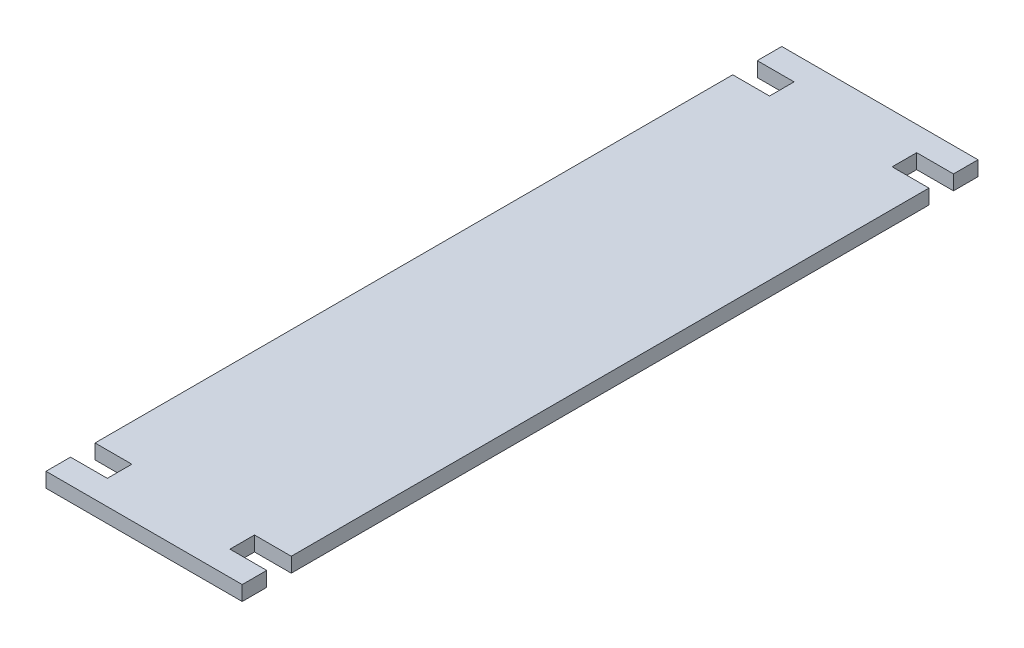
ISO-10303-21;
HEADER;
FILE_DESCRIPTION(('STEP AP214'),'2;1');
FILE_NAME('part.step','',(''),(''),'','','');
FILE_SCHEMA(('AUTOMOTIVE_DESIGN { 1 0 10303 214 1 1 1 1 }'));
ENDSEC;
DATA;
#1=APPLICATION_CONTEXT('core data for automotive mechanical design processes');
#2=APPLICATION_PROTOCOL_DEFINITION('international standard','automotive_design',2000,#1);
#3=PRODUCT_CONTEXT('',#1,'mechanical');
#4=PRODUCT('Part','Part','',(#3));
#5=PRODUCT_RELATED_PRODUCT_CATEGORY('part','',(#4));
#6=PRODUCT_DEFINITION_FORMATION('','',#4);
#7=PRODUCT_DEFINITION_CONTEXT('part definition',#1,'design');
#8=PRODUCT_DEFINITION('design','',#6,#7);
#9=PRODUCT_DEFINITION_SHAPE('','',#8);
#10=(LENGTH_UNIT() NAMED_UNIT(*) SI_UNIT(.MILLI.,.METRE.));
#11=(NAMED_UNIT(*) PLANE_ANGLE_UNIT() SI_UNIT($,.RADIAN.));
#12=(NAMED_UNIT(*) SI_UNIT($,.STERADIAN.) SOLID_ANGLE_UNIT());
#13=UNCERTAINTY_MEASURE_WITH_UNIT(LENGTH_MEASURE(1.E-05),#10,'distance_accuracy_value','');
#14=(GEOMETRIC_REPRESENTATION_CONTEXT(3) GLOBAL_UNCERTAINTY_ASSIGNED_CONTEXT((#13)) GLOBAL_UNIT_ASSIGNED_CONTEXT((#10,
#11,#12)) REPRESENTATION_CONTEXT('',''));
#15=CARTESIAN_POINT('',(0.,0.,0.));
#16=DIRECTION('',(0.,0.,1.));
#17=DIRECTION('',(1.,0.,0.));
#18=AXIS2_PLACEMENT_3D('',#15,#16,#17);
#19=CARTESIAN_POINT('',(0.,3.,0.));
#20=DIRECTION('',(1.,0.,0.));
#21=DIRECTION('',(0.,0.,-1.));
#22=AXIS2_PLACEMENT_3D('',#19,#20,#21);
#23=PLANE('',#22);
#24=DIRECTION('',(0.,-1.,0.));
#25=VECTOR('',#24,1.);
#26=CARTESIAN_POINT('',(0.,10.,-5.));
#27=LINE('',#26,#25);
#28=CARTESIAN_POINT('',(0.,3.,-5.));
#29=VERTEX_POINT('',#28);
#30=CARTESIAN_POINT('',(0.,0.,-5.));
#31=VERTEX_POINT('',#30);
#32=EDGE_CURVE('E198',#29,#31,#27,.T.);
#33=ORIENTED_EDGE('',*,*,#32,.T.);
#34=DIRECTION('',(0.,0.,1.));
#35=VECTOR('',#34,1.);
#36=CARTESIAN_POINT('',(0.,0.,0.));
#37=LINE('',#36,#35);
#38=CARTESIAN_POINT('',(0.,0.,0.));
#39=VERTEX_POINT('',#38);
#40=EDGE_CURVE('E228',#31,#39,#37,.T.);
#41=ORIENTED_EDGE('',*,*,#40,.T.);
#42=DIRECTION('',(0.,-1.,0.));
#43=VECTOR('',#42,1.);
#44=CARTESIAN_POINT('',(0.,3.,0.));
#45=LINE('',#44,#43);
#46=CARTESIAN_POINT('',(0.,3.,0.));
#47=VERTEX_POINT('',#46);
#48=EDGE_CURVE('E11',#47,#39,#45,.T.);
#49=ORIENTED_EDGE('',*,*,#48,.F.);
#50=DIRECTION('',(0.,0.,1.));
#51=VECTOR('',#50,1.);
#52=CARTESIAN_POINT('',(0.,3.,0.));
#53=LINE('',#52,#51);
#54=EDGE_CURVE('E210',#29,#47,#53,.T.);
#55=ORIENTED_EDGE('',*,*,#54,.F.);
#56=EDGE_LOOP('',(#33,#41,#49,#55));
#57=FACE_BOUND('',#56,.T.);
#58=ADVANCED_FACE('F38',(#57),#23,.F.);
#59=DIRECTION('',(0.,-1.,0.));
#60=VECTOR('',#59,1.);
#61=CARTESIAN_POINT('',(0.,10.,-10.));
#62=LINE('',#61,#60);
#63=CARTESIAN_POINT('',(0.,3.,-10.));
#64=VERTEX_POINT('',#63);
#65=CARTESIAN_POINT('',(0.,0.,-10.));
#66=VERTEX_POINT('',#65);
#67=EDGE_CURVE('E342',#64,#66,#62,.T.);
#68=ORIENTED_EDGE('',*,*,#67,.F.);
#69=CARTESIAN_POINT('',(0.,3.,-140.));
#70=VERTEX_POINT('',#69);
#71=EDGE_CURVE('E246',#70,#64,#53,.T.);
#72=ORIENTED_EDGE('',*,*,#71,.F.);
#73=DIRECTION('',(0.,-1.,0.));
#74=VECTOR('',#73,1.);
#75=CARTESIAN_POINT('',(0.,10.,-140.));
#76=LINE('',#75,#74);
#77=CARTESIAN_POINT('',(0.,0.,-140.));
#78=VERTEX_POINT('',#77);
#79=EDGE_CURVE('E290',#70,#78,#76,.T.);
#80=ORIENTED_EDGE('',*,*,#79,.T.);
#81=EDGE_CURVE('E226',#78,#66,#37,.T.);
#82=ORIENTED_EDGE('',*,*,#81,.T.);
#83=EDGE_LOOP('',(#68,#72,#80,#82));
#84=FACE_BOUND('',#83,.T.);
#85=ADVANCED_FACE('F422',(#84),#23,.F.);
#86=CARTESIAN_POINT('',(0.,0.,-150.));
#87=VERTEX_POINT('',#86);
#88=CARTESIAN_POINT('',(0.,0.,-145.));
#89=VERTEX_POINT('',#88);
#90=EDGE_CURVE('E222',#87,#89,#37,.T.);
#91=ORIENTED_EDGE('',*,*,#90,.T.);
#92=DIRECTION('',(0.,-1.,0.));
#93=VECTOR('',#92,1.);
#94=CARTESIAN_POINT('',(0.,10.,-145.));
#95=LINE('',#94,#93);
#96=CARTESIAN_POINT('',(0.,3.,-145.));
#97=VERTEX_POINT('',#96);
#98=EDGE_CURVE('E287',#97,#89,#95,.T.);
#99=ORIENTED_EDGE('',*,*,#98,.F.);
#100=CARTESIAN_POINT('',(0.,3.,-150.));
#101=VERTEX_POINT('',#100);
#102=EDGE_CURVE('E242',#101,#97,#53,.T.);
#103=ORIENTED_EDGE('',*,*,#102,.F.);
#104=DIRECTION('',(0.,-1.,0.));
#105=VECTOR('',#104,1.);
#106=CARTESIAN_POINT('',(0.,3.,-150.));
#107=LINE('',#106,#105);
#108=EDGE_CURVE('E233',#101,#87,#107,.T.);
#109=ORIENTED_EDGE('',*,*,#108,.T.);
#110=EDGE_LOOP('',(#91,#99,#103,#109));
#111=FACE_BOUND('',#110,.T.);
#112=ADVANCED_FACE('F405',(#111),#23,.F.);
#113=CARTESIAN_POINT('',(40.,3.,0.));
#114=DIRECTION('',(-1.,0.,0.));
#115=DIRECTION('',(0.,0.,1.));
#116=AXIS2_PLACEMENT_3D('',#113,#114,#115);
#117=PLANE('',#116);
#118=DIRECTION('',(0.,-1.,0.));
#119=VECTOR('',#118,1.);
#120=CARTESIAN_POINT('',(40.,10.,-140.));
#121=LINE('',#120,#119);
#122=CARTESIAN_POINT('',(40.,3.,-140.));
#123=VERTEX_POINT('',#122);
#124=CARTESIAN_POINT('',(40.,0.,-140.));
#125=VERTEX_POINT('',#124);
#126=EDGE_CURVE('E314',#123,#125,#121,.T.);
#127=ORIENTED_EDGE('',*,*,#126,.F.);
#128=DIRECTION('',(0.,0.,-1.));
#129=VECTOR('',#128,1.);
#130=CARTESIAN_POINT('',(40.,3.,0.));
#131=LINE('',#130,#129);
#132=CARTESIAN_POINT('',(40.,3.,-10.));
#133=VERTEX_POINT('',#132);
#134=EDGE_CURVE('E237',#133,#123,#131,.T.);
#135=ORIENTED_EDGE('',*,*,#134,.F.);
#136=DIRECTION('',(0.,-1.,0.));
#137=VECTOR('',#136,1.);
#138=CARTESIAN_POINT('',(40.,10.,-10.));
#139=LINE('',#138,#137);
#140=CARTESIAN_POINT('',(40.,0.,-10.));
#141=VERTEX_POINT('',#140);
#142=EDGE_CURVE('E185',#133,#141,#139,.T.);
#143=ORIENTED_EDGE('',*,*,#142,.T.);
#144=DIRECTION('',(0.,0.,-1.));
#145=VECTOR('',#144,1.);
#146=CARTESIAN_POINT('',(40.,0.,0.));
#147=LINE('',#146,#145);
#148=EDGE_CURVE('E205',#141,#125,#147,.T.);
#149=ORIENTED_EDGE('',*,*,#148,.T.);
#150=EDGE_LOOP('',(#127,#135,#143,#149));
#151=FACE_BOUND('',#150,.T.);
#152=ADVANCED_FACE('F375',(#151),#117,.F.);
#153=DIRECTION('',(0.,-1.,0.));
#154=VECTOR('',#153,1.);
#155=CARTESIAN_POINT('',(40.,10.,-145.));
#156=LINE('',#155,#154);
#157=CARTESIAN_POINT('',(40.,3.,-145.));
#158=VERTEX_POINT('',#157);
#159=CARTESIAN_POINT('',(40.,0.,-145.));
#160=VERTEX_POINT('',#159);
#161=EDGE_CURVE('E317',#158,#160,#156,.T.);
#162=ORIENTED_EDGE('',*,*,#161,.T.);
#163=CARTESIAN_POINT('',(40.,0.,-150.));
#164=VERTEX_POINT('',#163);
#165=EDGE_CURVE('E207',#160,#164,#147,.T.);
#166=ORIENTED_EDGE('',*,*,#165,.T.);
#167=DIRECTION('',(0.,-1.,0.));
#168=VECTOR('',#167,1.);
#169=CARTESIAN_POINT('',(40.,3.,-150.));
#170=LINE('',#169,#168);
#171=CARTESIAN_POINT('',(40.,3.,-150.));
#172=VERTEX_POINT('',#171);
#173=EDGE_CURVE('E391',#172,#164,#170,.T.);
#174=ORIENTED_EDGE('',*,*,#173,.F.);
#175=EDGE_CURVE('E238',#158,#172,#131,.T.);
#176=ORIENTED_EDGE('',*,*,#175,.F.);
#177=EDGE_LOOP('',(#162,#166,#174,#176));
#178=FACE_BOUND('',#177,.T.);
#179=ADVANCED_FACE('F392',(#178),#117,.F.);
#180=CARTESIAN_POINT('',(40.,0.,0.));
#181=VERTEX_POINT('',#180);
#182=CARTESIAN_POINT('',(40.,0.,-5.));
#183=VERTEX_POINT('',#182);
#184=EDGE_CURVE('E192',#181,#183,#147,.T.);
#185=ORIENTED_EDGE('',*,*,#184,.T.);
#186=DIRECTION('',(0.,-1.,0.));
#187=VECTOR('',#186,1.);
#188=CARTESIAN_POINT('',(40.,10.,-5.));
#189=LINE('',#188,#187);
#190=CARTESIAN_POINT('',(40.,3.,-5.));
#191=VERTEX_POINT('',#190);
#192=EDGE_CURVE('E175',#191,#183,#189,.T.);
#193=ORIENTED_EDGE('',*,*,#192,.F.);
#194=CARTESIAN_POINT('',(40.,3.,0.));
#195=VERTEX_POINT('',#194);
#196=EDGE_CURVE('E234',#195,#191,#131,.T.);
#197=ORIENTED_EDGE('',*,*,#196,.F.);
#198=DIRECTION('',(0.,-1.,0.));
#199=VECTOR('',#198,1.);
#200=CARTESIAN_POINT('',(40.,3.,0.));
#201=LINE('',#200,#199);
#202=EDGE_CURVE('E46',#195,#181,#201,.T.);
#203=ORIENTED_EDGE('',*,*,#202,.T.);
#204=EDGE_LOOP('',(#185,#193,#197,#203));
#205=FACE_BOUND('',#204,.T.);
#206=ADVANCED_FACE('F201',(#205),#117,.F.);
#207=CARTESIAN_POINT('',(0.,3.,0.));
#208=DIRECTION('',(0.,-1.,0.));
#209=DIRECTION('',(0.,0.,-1.));
#210=AXIS2_PLACEMENT_3D('',#207,#208,#209);
#211=PLANE('',#210);
#212=DIRECTION('',(1.,0.,0.));
#213=VECTOR('',#212,1.);
#214=CARTESIAN_POINT('',(0.,3.,-140.));
#215=LINE('',#214,#213);
#216=CARTESIAN_POINT('',(32.5,3.,-140.));
#217=VERTEX_POINT('',#216);
#218=EDGE_CURVE('E250',#217,#123,#215,.T.);
#219=ORIENTED_EDGE('',*,*,#218,.F.);
#220=DIRECTION('',(0.,0.,1.));
#221=VECTOR('',#220,1.);
#222=CARTESIAN_POINT('',(32.5,3.,0.));
#223=LINE('',#222,#221);
#224=CARTESIAN_POINT('',(32.5,3.,-145.));
#225=VERTEX_POINT('',#224);
#226=EDGE_CURVE('E247',#225,#217,#223,.T.);
#227=ORIENTED_EDGE('',*,*,#226,.F.);
#228=DIRECTION('',(-1.,0.,0.));
#229=VECTOR('',#228,1.);
#230=CARTESIAN_POINT('',(0.,3.,-145.));
#231=LINE('',#230,#229);
#232=EDGE_CURVE('E253',#158,#225,#231,.T.);
#233=ORIENTED_EDGE('',*,*,#232,.F.);
#234=ORIENTED_EDGE('',*,*,#175,.T.);
#235=DIRECTION('',(-1.,0.,0.));
#236=VECTOR('',#235,1.);
#237=CARTESIAN_POINT('',(0.,3.,-150.));
#238=LINE('',#237,#236);
#239=EDGE_CURVE('E230',#172,#101,#238,.T.);
#240=ORIENTED_EDGE('',*,*,#239,.T.);
#241=ORIENTED_EDGE('',*,*,#102,.T.);
#242=DIRECTION('',(1.,0.,0.));
#243=VECTOR('',#242,1.);
#244=CARTESIAN_POINT('',(0.,3.,-145.));
#245=LINE('',#244,#243);
#246=CARTESIAN_POINT('',(7.5,3.,-145.));
#247=VERTEX_POINT('',#246);
#248=EDGE_CURVE('E275',#97,#247,#245,.T.);
#249=ORIENTED_EDGE('',*,*,#248,.T.);
#250=DIRECTION('',(0.,0.,1.));
#251=VECTOR('',#250,1.);
#252=CARTESIAN_POINT('',(7.50000000000002,3.,0.));
#253=LINE('',#252,#251);
#254=CARTESIAN_POINT('',(7.5,3.,-140.));
#255=VERTEX_POINT('',#254);
#256=EDGE_CURVE('E283',#247,#255,#253,.T.);
#257=ORIENTED_EDGE('',*,*,#256,.T.);
#258=DIRECTION('',(-1.,0.,0.));
#259=VECTOR('',#258,1.);
#260=CARTESIAN_POINT('',(0.,3.,-140.));
#261=LINE('',#260,#259);
#262=EDGE_CURVE('E279',#255,#70,#261,.T.);
#263=ORIENTED_EDGE('',*,*,#262,.T.);
#264=ORIENTED_EDGE('',*,*,#71,.T.);
#265=DIRECTION('',(-1.,0.,0.));
#266=VECTOR('',#265,1.);
#267=CARTESIAN_POINT('',(0.,3.,-10.));
#268=LINE('',#267,#266);
#269=CARTESIAN_POINT('',(7.5,3.,-10.));
#270=VERTEX_POINT('',#269);
#271=EDGE_CURVE('E262',#270,#64,#268,.T.);
#272=ORIENTED_EDGE('',*,*,#271,.F.);
#273=DIRECTION('',(0.,0.,-1.));
#274=VECTOR('',#273,1.);
#275=CARTESIAN_POINT('',(7.5,3.,0.));
#276=LINE('',#275,#274);
#277=CARTESIAN_POINT('',(7.5,3.,-5.));
#278=VERTEX_POINT('',#277);
#279=EDGE_CURVE('E259',#278,#270,#276,.T.);
#280=ORIENTED_EDGE('',*,*,#279,.F.);
#281=DIRECTION('',(1.,0.,0.));
#282=VECTOR('',#281,1.);
#283=CARTESIAN_POINT('',(0.,3.,-5.));
#284=LINE('',#283,#282);
#285=EDGE_CURVE('E256',#29,#278,#284,.T.);
#286=ORIENTED_EDGE('',*,*,#285,.F.);
#287=ORIENTED_EDGE('',*,*,#54,.T.);
#288=DIRECTION('',(1.,0.,0.));
#289=VECTOR('',#288,1.);
#290=CARTESIAN_POINT('',(0.,3.,0.));
#291=LINE('',#290,#289);
#292=EDGE_CURVE('E239',#47,#195,#291,.T.);
#293=ORIENTED_EDGE('',*,*,#292,.T.);
#294=ORIENTED_EDGE('',*,*,#196,.T.);
#295=DIRECTION('',(-1.,0.,0.));
#296=VECTOR('',#295,1.);
#297=CARTESIAN_POINT('',(0.,3.,-5.));
#298=LINE('',#297,#296);
#299=CARTESIAN_POINT('',(32.5,3.,-5.));
#300=VERTEX_POINT('',#299);
#301=EDGE_CURVE('E178',#191,#300,#298,.T.);
#302=ORIENTED_EDGE('',*,*,#301,.T.);
#303=DIRECTION('',(0.,0.,-1.));
#304=VECTOR('',#303,1.);
#305=CARTESIAN_POINT('',(32.5,3.,0.));
#306=LINE('',#305,#304);
#307=CARTESIAN_POINT('',(32.5,3.,-10.));
#308=VERTEX_POINT('',#307);
#309=EDGE_CURVE('E271',#300,#308,#306,.T.);
#310=ORIENTED_EDGE('',*,*,#309,.T.);
#311=DIRECTION('',(1.,0.,0.));
#312=VECTOR('',#311,1.);
#313=CARTESIAN_POINT('',(0.,3.,-10.));
#314=LINE('',#313,#312);
#315=EDGE_CURVE('E267',#308,#133,#314,.T.);
#316=ORIENTED_EDGE('',*,*,#315,.T.);
#317=ORIENTED_EDGE('',*,*,#134,.T.);
#318=EDGE_LOOP('',(#219,#227,#233,#234,#240,#241,#249,#257,#263,#264,#272,#280,#286,#287,#293,
#294,#302,#310,#316,#317));
#319=FACE_BOUND('',#318,.T.);
#320=ADVANCED_FACE('F383',(#319),#211,.F.);
#321=CARTESIAN_POINT('',(0.,0.,0.));
#322=DIRECTION('',(0.,-1.,0.));
#323=DIRECTION('',(0.,0.,-1.));
#324=AXIS2_PLACEMENT_3D('',#321,#322,#323);
#325=PLANE('',#324);
#326=DIRECTION('',(0.,0.,1.));
#327=VECTOR('',#326,1.);
#328=CARTESIAN_POINT('',(32.5,0.,0.));
#329=LINE('',#328,#327);
#330=CARTESIAN_POINT('',(32.5,0.,-145.));
#331=VERTEX_POINT('',#330);
#332=CARTESIAN_POINT('',(32.5,0.,-140.));
#333=VERTEX_POINT('',#332);
#334=EDGE_CURVE('E53',#331,#333,#329,.T.);
#335=ORIENTED_EDGE('',*,*,#334,.T.);
#336=DIRECTION('',(1.,0.,0.));
#337=VECTOR('',#336,1.);
#338=CARTESIAN_POINT('',(0.,0.,-140.));
#339=LINE('',#338,#337);
#340=EDGE_CURVE('E327',#333,#125,#339,.T.);
#341=ORIENTED_EDGE('',*,*,#340,.T.);
#342=ORIENTED_EDGE('',*,*,#148,.F.);
#343=DIRECTION('',(1.,0.,0.));
#344=VECTOR('',#343,1.);
#345=CARTESIAN_POINT('',(0.,0.,-10.));
#346=LINE('',#345,#344);
#347=CARTESIAN_POINT('',(32.5,0.,-10.));
#348=VERTEX_POINT('',#347);
#349=EDGE_CURVE('E197',#348,#141,#346,.T.);
#350=ORIENTED_EDGE('',*,*,#349,.F.);
#351=DIRECTION('',(0.,0.,-1.));
#352=VECTOR('',#351,1.);
#353=CARTESIAN_POINT('',(32.5,0.,0.));
#354=LINE('',#353,#352);
#355=CARTESIAN_POINT('',(32.5,0.,-5.));
#356=VERTEX_POINT('',#355);
#357=EDGE_CURVE('E195',#356,#348,#354,.T.);
#358=ORIENTED_EDGE('',*,*,#357,.F.);
#359=DIRECTION('',(-1.,0.,0.));
#360=VECTOR('',#359,1.);
#361=CARTESIAN_POINT('',(0.,0.,-5.));
#362=LINE('',#361,#360);
#363=EDGE_CURVE('E61',#183,#356,#362,.T.);
#364=ORIENTED_EDGE('',*,*,#363,.F.);
#365=ORIENTED_EDGE('',*,*,#184,.F.);
#366=DIRECTION('',(1.,0.,0.));
#367=VECTOR('',#366,1.);
#368=CARTESIAN_POINT('',(0.,0.,0.));
#369=LINE('',#368,#367);
#370=EDGE_CURVE('E215',#39,#181,#369,.T.);
#371=ORIENTED_EDGE('',*,*,#370,.F.);
#372=ORIENTED_EDGE('',*,*,#40,.F.);
#373=DIRECTION('',(1.,0.,0.));
#374=VECTOR('',#373,1.);
#375=CARTESIAN_POINT('',(0.,0.,-5.));
#376=LINE('',#375,#374);
#377=CARTESIAN_POINT('',(7.5,0.,-5.));
#378=VERTEX_POINT('',#377);
#379=EDGE_CURVE('E313',#31,#378,#376,.T.);
#380=ORIENTED_EDGE('',*,*,#379,.T.);
#381=DIRECTION('',(0.,0.,-1.));
#382=VECTOR('',#381,1.);
#383=CARTESIAN_POINT('',(7.5,0.,0.));
#384=LINE('',#383,#382);
#385=CARTESIAN_POINT('',(7.5,0.,-10.));
#386=VERTEX_POINT('',#385);
#387=EDGE_CURVE('E349',#378,#386,#384,.T.);
#388=ORIENTED_EDGE('',*,*,#387,.T.);
#389=DIRECTION('',(-1.,0.,0.));
#390=VECTOR('',#389,1.);
#391=CARTESIAN_POINT('',(0.,0.,-10.));
#392=LINE('',#391,#390);
#393=EDGE_CURVE('E345',#386,#66,#392,.T.);
#394=ORIENTED_EDGE('',*,*,#393,.T.);
#395=ORIENTED_EDGE('',*,*,#81,.F.);
#396=DIRECTION('',(-1.,0.,0.));
#397=VECTOR('',#396,1.);
#398=CARTESIAN_POINT('',(0.,0.,-140.));
#399=LINE('',#398,#397);
#400=CARTESIAN_POINT('',(7.5,0.,-140.));
#401=VERTEX_POINT('',#400);
#402=EDGE_CURVE('E305',#401,#78,#399,.T.);
#403=ORIENTED_EDGE('',*,*,#402,.F.);
#404=DIRECTION('',(0.,0.,1.));
#405=VECTOR('',#404,1.);
#406=CARTESIAN_POINT('',(7.50000000000002,0.,0.));
#407=LINE('',#406,#405);
#408=CARTESIAN_POINT('',(7.5,0.,-145.));
#409=VERTEX_POINT('',#408);
#410=EDGE_CURVE('E301',#409,#401,#407,.T.);
#411=ORIENTED_EDGE('',*,*,#410,.F.);
#412=DIRECTION('',(1.,0.,0.));
#413=VECTOR('',#412,1.);
#414=CARTESIAN_POINT('',(0.,0.,-145.));
#415=LINE('',#414,#413);
#416=EDGE_CURVE('E184',#89,#409,#415,.T.);
#417=ORIENTED_EDGE('',*,*,#416,.F.);
#418=ORIENTED_EDGE('',*,*,#90,.F.);
#419=DIRECTION('',(-1.,0.,0.));
#420=VECTOR('',#419,1.);
#421=CARTESIAN_POINT('',(0.,0.,-150.));
#422=LINE('',#421,#420);
#423=EDGE_CURVE('E204',#164,#87,#422,.T.);
#424=ORIENTED_EDGE('',*,*,#423,.F.);
#425=ORIENTED_EDGE('',*,*,#165,.F.);
#426=DIRECTION('',(-1.,0.,0.));
#427=VECTOR('',#426,1.);
#428=CARTESIAN_POINT('',(0.,0.,-145.));
#429=LINE('',#428,#427);
#430=EDGE_CURVE('E323',#160,#331,#429,.T.);
#431=ORIENTED_EDGE('',*,*,#430,.T.);
#432=EDGE_LOOP('',(#335,#341,#342,#350,#358,#364,#365,#371,#372,#380,#388,#394,#395,#403,#411,
#417,#418,#424,#425,#431));
#433=FACE_BOUND('',#432,.T.);
#434=ADVANCED_FACE('F190',(#433),#325,.T.);
#435=CARTESIAN_POINT('',(0.,3.,0.));
#436=DIRECTION('',(0.,0.,-1.));
#437=DIRECTION('',(-1.,0.,0.));
#438=AXIS2_PLACEMENT_3D('',#435,#436,#437);
#439=PLANE('',#438);
#440=ORIENTED_EDGE('',*,*,#370,.T.);
#441=ORIENTED_EDGE('',*,*,#202,.F.);
#442=ORIENTED_EDGE('',*,*,#292,.F.);
#443=ORIENTED_EDGE('',*,*,#48,.T.);
#444=EDGE_LOOP('',(#440,#441,#442,#443));
#445=FACE_BOUND('',#444,.T.);
#446=ADVANCED_FACE('F433',(#445),#439,.F.);
#447=CARTESIAN_POINT('',(0.,3.,-150.));
#448=DIRECTION('',(0.,0.,1.));
#449=DIRECTION('',(1.,0.,0.));
#450=AXIS2_PLACEMENT_3D('',#447,#448,#449);
#451=PLANE('',#450);
#452=ORIENTED_EDGE('',*,*,#423,.T.);
#453=ORIENTED_EDGE('',*,*,#108,.F.);
#454=ORIENTED_EDGE('',*,*,#239,.F.);
#455=ORIENTED_EDGE('',*,*,#173,.T.);
#456=EDGE_LOOP('',(#452,#453,#454,#455));
#457=FACE_BOUND('',#456,.T.);
#458=ADVANCED_FACE('F397',(#457),#451,.F.);
#459=CARTESIAN_POINT('',(0.,10.,-145.));
#460=DIRECTION('',(0.,0.,-1.));
#461=DIRECTION('',(-1.,0.,0.));
#462=AXIS2_PLACEMENT_3D('',#459,#460,#461);
#463=PLANE('',#462);
#464=ORIENTED_EDGE('',*,*,#98,.T.);
#465=ORIENTED_EDGE('',*,*,#416,.T.);
#466=DIRECTION('',(0.,-1.,0.));
#467=VECTOR('',#466,1.);
#468=CARTESIAN_POINT('',(7.5,10.,-145.));
#469=LINE('',#468,#467);
#470=EDGE_CURVE('E297',#247,#409,#469,.T.);
#471=ORIENTED_EDGE('',*,*,#470,.F.);
#472=ORIENTED_EDGE('',*,*,#248,.F.);
#473=EDGE_LOOP('',(#464,#465,#471,#472));
#474=FACE_BOUND('',#473,.T.);
#475=ADVANCED_FACE('F408',(#474),#463,.F.);
#476=CARTESIAN_POINT('',(0.,10.,-140.));
#477=DIRECTION('',(0.,0.,1.));
#478=DIRECTION('',(1.,0.,0.));
#479=AXIS2_PLACEMENT_3D('',#476,#477,#478);
#480=PLANE('',#479);
#481=DIRECTION('',(0.,-1.,0.));
#482=VECTOR('',#481,1.);
#483=CARTESIAN_POINT('',(7.5,10.,-140.));
#484=LINE('',#483,#482);
#485=EDGE_CURVE('E294',#255,#401,#484,.T.);
#486=ORIENTED_EDGE('',*,*,#485,.T.);
#487=ORIENTED_EDGE('',*,*,#402,.T.);
#488=ORIENTED_EDGE('',*,*,#79,.F.);
#489=ORIENTED_EDGE('',*,*,#262,.F.);
#490=EDGE_LOOP('',(#486,#487,#488,#489));
#491=FACE_BOUND('',#490,.T.);
#492=ADVANCED_FACE('F418',(#491),#480,.F.);
#493=CARTESIAN_POINT('',(7.50000000000002,10.,0.));
#494=DIRECTION('',(1.,0.,0.));
#495=DIRECTION('',(0.,0.,-1.));
#496=AXIS2_PLACEMENT_3D('',#493,#494,#495);
#497=PLANE('',#496);
#498=ORIENTED_EDGE('',*,*,#470,.T.);
#499=ORIENTED_EDGE('',*,*,#410,.T.);
#500=ORIENTED_EDGE('',*,*,#485,.F.);
#501=ORIENTED_EDGE('',*,*,#256,.F.);
#502=EDGE_LOOP('',(#498,#499,#500,#501));
#503=FACE_BOUND('',#502,.T.);
#504=ADVANCED_FACE('F412',(#503),#497,.F.);
#505=CARTESIAN_POINT('',(0.,10.,-5.));
#506=DIRECTION('',(0.,0.,1.));
#507=DIRECTION('',(1.,0.,0.));
#508=AXIS2_PLACEMENT_3D('',#505,#506,#507);
#509=PLANE('',#508);
#510=ORIENTED_EDGE('',*,*,#192,.T.);
#511=ORIENTED_EDGE('',*,*,#363,.T.);
#512=DIRECTION('',(0.,-1.,0.));
#513=VECTOR('',#512,1.);
#514=CARTESIAN_POINT('',(32.5,10.,-5.));
#515=LINE('',#514,#513);
#516=EDGE_CURVE('E362',#300,#356,#515,.T.);
#517=ORIENTED_EDGE('',*,*,#516,.F.);
#518=ORIENTED_EDGE('',*,*,#301,.F.);
#519=EDGE_LOOP('',(#510,#511,#517,#518));
#520=FACE_BOUND('',#519,.T.);
#521=ADVANCED_FACE('F176',(#520),#509,.F.);
#522=CARTESIAN_POINT('',(0.,10.,-10.));
#523=DIRECTION('',(0.,0.,-1.));
#524=DIRECTION('',(-1.,0.,0.));
#525=AXIS2_PLACEMENT_3D('',#522,#523,#524);
#526=PLANE('',#525);
#527=DIRECTION('',(0.,-1.,0.));
#528=VECTOR('',#527,1.);
#529=CARTESIAN_POINT('',(32.5,10.,-10.));
#530=LINE('',#529,#528);
#531=EDGE_CURVE('E359',#308,#348,#530,.T.);
#532=ORIENTED_EDGE('',*,*,#531,.T.);
#533=ORIENTED_EDGE('',*,*,#349,.T.);
#534=ORIENTED_EDGE('',*,*,#142,.F.);
#535=ORIENTED_EDGE('',*,*,#315,.F.);
#536=EDGE_LOOP('',(#532,#533,#534,#535));
#537=FACE_BOUND('',#536,.T.);
#538=ADVANCED_FACE('F369',(#537),#526,.F.);
#539=CARTESIAN_POINT('',(32.5,10.,0.));
#540=DIRECTION('',(-1.,0.,0.));
#541=DIRECTION('',(0.,0.,1.));
#542=AXIS2_PLACEMENT_3D('',#539,#540,#541);
#543=PLANE('',#542);
#544=ORIENTED_EDGE('',*,*,#516,.T.);
#545=ORIENTED_EDGE('',*,*,#357,.T.);
#546=ORIENTED_EDGE('',*,*,#531,.F.);
#547=ORIENTED_EDGE('',*,*,#309,.F.);
#548=EDGE_LOOP('',(#544,#545,#546,#547));
#549=FACE_BOUND('',#548,.T.);
#550=ADVANCED_FACE('F563',(#549),#543,.F.);
#551=CARTESIAN_POINT('',(0.,10.,-5.));
#552=DIRECTION('',(0.,0.,-1.));
#553=DIRECTION('',(-1.,0.,0.));
#554=AXIS2_PLACEMENT_3D('',#551,#552,#553);
#555=PLANE('',#554);
#556=ORIENTED_EDGE('',*,*,#285,.T.);
#557=DIRECTION('',(0.,-1.,0.));
#558=VECTOR('',#557,1.);
#559=CARTESIAN_POINT('',(7.5,10.,-5.));
#560=LINE('',#559,#558);
#561=EDGE_CURVE('E336',#278,#378,#560,.T.);
#562=ORIENTED_EDGE('',*,*,#561,.T.);
#563=ORIENTED_EDGE('',*,*,#379,.F.);
#564=ORIENTED_EDGE('',*,*,#32,.F.);
#565=EDGE_LOOP('',(#556,#562,#563,#564));
#566=FACE_BOUND('',#565,.T.);
#567=ADVANCED_FACE('F439',(#566),#555,.T.);
#568=CARTESIAN_POINT('',(7.5,10.,0.));
#569=DIRECTION('',(-1.,0.,0.));
#570=DIRECTION('',(0.,0.,1.));
#571=AXIS2_PLACEMENT_3D('',#568,#569,#570);
#572=PLANE('',#571);
#573=ORIENTED_EDGE('',*,*,#279,.T.);
#574=DIRECTION('',(0.,-1.,0.));
#575=VECTOR('',#574,1.);
#576=CARTESIAN_POINT('',(7.5,10.,-10.));
#577=LINE('',#576,#575);
#578=EDGE_CURVE('E339',#270,#386,#577,.T.);
#579=ORIENTED_EDGE('',*,*,#578,.T.);
#580=ORIENTED_EDGE('',*,*,#387,.F.);
#581=ORIENTED_EDGE('',*,*,#561,.F.);
#582=EDGE_LOOP('',(#573,#579,#580,#581));
#583=FACE_BOUND('',#582,.T.);
#584=ADVANCED_FACE('F442',(#583),#572,.T.);
#585=CARTESIAN_POINT('',(0.,10.,-10.));
#586=DIRECTION('',(0.,0.,1.));
#587=DIRECTION('',(1.,0.,0.));
#588=AXIS2_PLACEMENT_3D('',#585,#586,#587);
#589=PLANE('',#588);
#590=ORIENTED_EDGE('',*,*,#271,.T.);
#591=ORIENTED_EDGE('',*,*,#67,.T.);
#592=ORIENTED_EDGE('',*,*,#393,.F.);
#593=ORIENTED_EDGE('',*,*,#578,.F.);
#594=EDGE_LOOP('',(#590,#591,#592,#593));
#595=FACE_BOUND('',#594,.T.);
#596=ADVANCED_FACE('F446',(#595),#589,.T.);
#597=CARTESIAN_POINT('',(32.5,10.,0.));
#598=DIRECTION('',(1.,0.,0.));
#599=DIRECTION('',(0.,0.,-1.));
#600=AXIS2_PLACEMENT_3D('',#597,#598,#599);
#601=PLANE('',#600);
#602=ORIENTED_EDGE('',*,*,#226,.T.);
#603=DIRECTION('',(0.,-1.,0.));
#604=VECTOR('',#603,1.);
#605=CARTESIAN_POINT('',(32.5,10.,-140.));
#606=LINE('',#605,#604);
#607=EDGE_CURVE('E310',#217,#333,#606,.T.);
#608=ORIENTED_EDGE('',*,*,#607,.T.);
#609=ORIENTED_EDGE('',*,*,#334,.F.);
#610=DIRECTION('',(0.,-1.,0.));
#611=VECTOR('',#610,1.);
#612=CARTESIAN_POINT('',(32.5,10.,-145.));
#613=LINE('',#612,#611);
#614=EDGE_CURVE('E320',#225,#331,#613,.T.);
#615=ORIENTED_EDGE('',*,*,#614,.F.);
#616=EDGE_LOOP('',(#602,#608,#609,#615));
#617=FACE_BOUND('',#616,.T.);
#618=ADVANCED_FACE('F448',(#617),#601,.T.);
#619=CARTESIAN_POINT('',(0.,10.,-140.));
#620=DIRECTION('',(0.,0.,-1.));
#621=DIRECTION('',(-1.,0.,0.));
#622=AXIS2_PLACEMENT_3D('',#619,#620,#621);
#623=PLANE('',#622);
#624=ORIENTED_EDGE('',*,*,#218,.T.);
#625=ORIENTED_EDGE('',*,*,#126,.T.);
#626=ORIENTED_EDGE('',*,*,#340,.F.);
#627=ORIENTED_EDGE('',*,*,#607,.F.);
#628=EDGE_LOOP('',(#624,#625,#626,#627));
#629=FACE_BOUND('',#628,.T.);
#630=ADVANCED_FACE('F380',(#629),#623,.T.);
#631=CARTESIAN_POINT('',(0.,10.,-145.));
#632=DIRECTION('',(0.,0.,1.));
#633=DIRECTION('',(1.,0.,0.));
#634=AXIS2_PLACEMENT_3D('',#631,#632,#633);
#635=PLANE('',#634);
#636=ORIENTED_EDGE('',*,*,#232,.T.);
#637=ORIENTED_EDGE('',*,*,#614,.T.);
#638=ORIENTED_EDGE('',*,*,#430,.F.);
#639=ORIENTED_EDGE('',*,*,#161,.F.);
#640=EDGE_LOOP('',(#636,#637,#638,#639));
#641=FACE_BOUND('',#640,.T.);
#642=ADVANCED_FACE('F600',(#641),#635,.T.);
#643=CLOSED_SHELL('',(#58,#85,#112,#152,#179,#206,#320,#434,#446,#458,#475,#492,#504,#521,#538,
#550,#567,#584,#596,#618,#630,#642));
#644=MANIFOLD_SOLID_BREP('B2',#643);
#645=ADVANCED_BREP_SHAPE_REPRESENTATION('',(#18,#644),#14);
#646=SHAPE_DEFINITION_REPRESENTATION(#9,#645);
ENDSEC;
END-ISO-10303-21;
